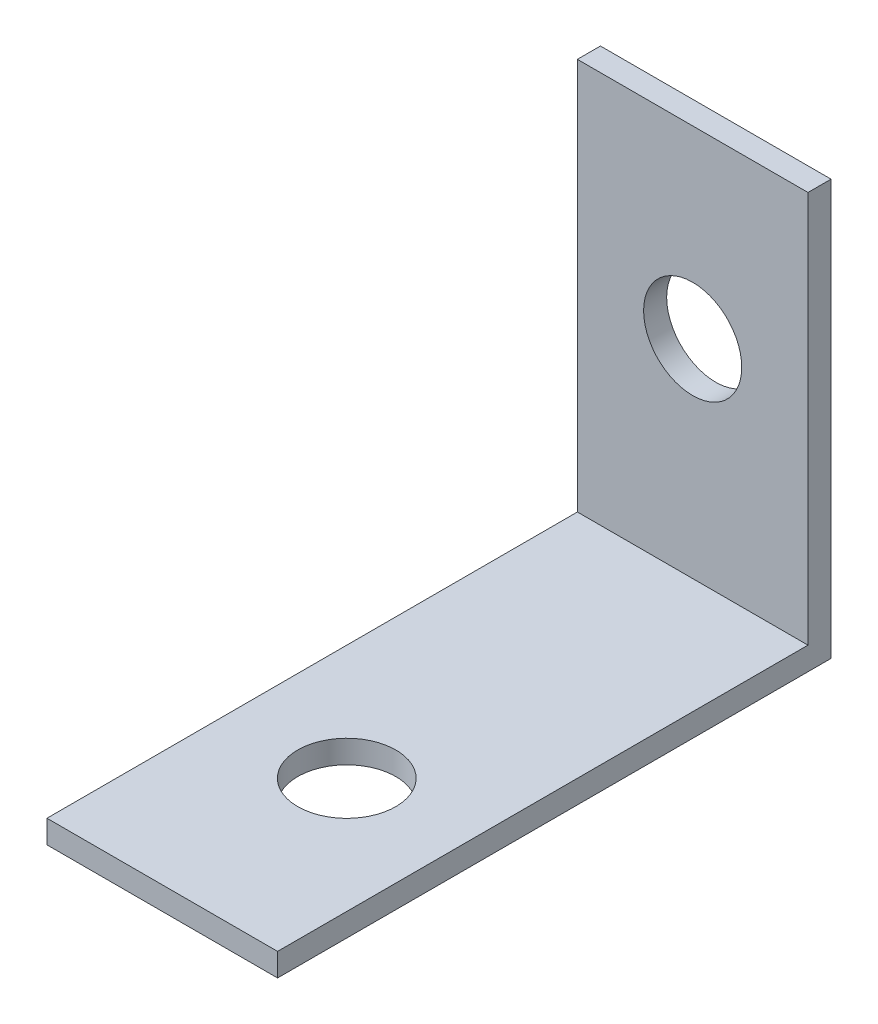
ISO-10303-21;
HEADER;
FILE_DESCRIPTION(('STEP AP214'),'2;1');
FILE_NAME('part.step','',(''),(''),'','','');
FILE_SCHEMA(('AUTOMOTIVE_DESIGN { 1 0 10303 214 1 1 1 1 }'));
ENDSEC;
DATA;
#1=APPLICATION_CONTEXT('core data for automotive mechanical design processes');
#2=APPLICATION_PROTOCOL_DEFINITION('international standard','automotive_design',2000,#1);
#3=PRODUCT_CONTEXT('',#1,'mechanical');
#4=PRODUCT('Part','Part','',(#3));
#5=PRODUCT_RELATED_PRODUCT_CATEGORY('part','',(#4));
#6=PRODUCT_DEFINITION_FORMATION('','',#4);
#7=PRODUCT_DEFINITION_CONTEXT('part definition',#1,'design');
#8=PRODUCT_DEFINITION('design','',#6,#7);
#9=PRODUCT_DEFINITION_SHAPE('','',#8);
#10=(LENGTH_UNIT() NAMED_UNIT(*) SI_UNIT(.MILLI.,.METRE.));
#11=(NAMED_UNIT(*) PLANE_ANGLE_UNIT() SI_UNIT($,.RADIAN.));
#12=(NAMED_UNIT(*) SI_UNIT($,.STERADIAN.) SOLID_ANGLE_UNIT());
#13=UNCERTAINTY_MEASURE_WITH_UNIT(LENGTH_MEASURE(1.E-05),#10,'distance_accuracy_value','');
#14=(GEOMETRIC_REPRESENTATION_CONTEXT(3) GLOBAL_UNCERTAINTY_ASSIGNED_CONTEXT((#13)) GLOBAL_UNIT_ASSIGNED_CONTEXT((#10,
#11,#12)) REPRESENTATION_CONTEXT('',''));
#15=CARTESIAN_POINT('',(0.,0.,0.));
#16=DIRECTION('',(0.,0.,1.));
#17=DIRECTION('',(1.,0.,0.));
#18=AXIS2_PLACEMENT_3D('',#15,#16,#17);
#19=CARTESIAN_POINT('',(15.875,0.,-1.5875));
#20=DIRECTION('',(0.,0.,1.));
#21=DIRECTION('',(1.,0.,0.));
#22=AXIS2_PLACEMENT_3D('',#19,#20,#21);
#23=PLANE('',#22);
#24=DIRECTION('',(0.,1.,0.));
#25=VECTOR('',#24,1.);
#26=CARTESIAN_POINT('',(15.875,0.,-1.5875));
#27=LINE('',#26,#25);
#28=CARTESIAN_POINT('',(15.875,-1.5875,-1.5875));
#29=VERTEX_POINT('',#28);
#30=CARTESIAN_POINT('',(15.875,26.9875,-1.5875));
#31=VERTEX_POINT('',#30);
#32=EDGE_CURVE('E85',#29,#31,#27,.T.);
#33=ORIENTED_EDGE('',*,*,#32,.F.);
#34=DIRECTION('',(1.,0.,0.));
#35=VECTOR('',#34,1.);
#36=CARTESIAN_POINT('',(0.,-1.5875,-1.5875));
#37=LINE('',#36,#35);
#38=CARTESIAN_POINT('',(0.,-1.5875,-1.5875));
#39=VERTEX_POINT('',#38);
#40=EDGE_CURVE('E125',#39,#29,#37,.T.);
#41=ORIENTED_EDGE('',*,*,#40,.F.);
#42=DIRECTION('',(0.,1.,0.));
#43=VECTOR('',#42,1.);
#44=CARTESIAN_POINT('',(0.,0.,-1.5875));
#45=LINE('',#44,#43);
#46=CARTESIAN_POINT('',(0.,26.9875,-1.5875));
#47=VERTEX_POINT('',#46);
#48=EDGE_CURVE('E141',#39,#47,#45,.T.);
#49=ORIENTED_EDGE('',*,*,#48,.T.);
#50=DIRECTION('',(-1.,0.,0.));
#51=VECTOR('',#50,1.);
#52=CARTESIAN_POINT('',(15.875,26.9875,-1.5875));
#53=LINE('',#52,#51);
#54=EDGE_CURVE('E11',#31,#47,#53,.T.);
#55=ORIENTED_EDGE('',*,*,#54,.F.);
#56=EDGE_LOOP('',(#33,#41,#49,#55));
#57=FACE_BOUND('',#56,.T.);
#58=CARTESIAN_POINT('',(7.9375,14.2875,-1.5875));
#59=DIRECTION('',(0.,0.,-1.));
#60=DIRECTION('',(-1.,0.,0.));
#61=AXIS2_PLACEMENT_3D('',#58,#59,#60);
#62=CIRCLE('',#61,3.37819999999999);
#63=CARTESIAN_POINT('',(4.55930000000001,14.2875,-1.5875));
#64=VERTEX_POINT('',#63);
#65=EDGE_CURVE('E135',#64,#64,#62,.T.);
#66=ORIENTED_EDGE('',*,*,#65,.F.);
#67=EDGE_LOOP('',(#66));
#68=FACE_BOUND('',#67,.T.);
#69=ADVANCED_FACE('F43',(#57,#68),#23,.F.);
#70=CARTESIAN_POINT('',(15.875,26.9875,0.));
#71=DIRECTION('',(0.,1.,0.));
#72=DIRECTION('',(0.,0.,1.));
#73=AXIS2_PLACEMENT_3D('',#70,#71,#72);
#74=PLANE('',#73);
#75=ORIENTED_EDGE('',*,*,#54,.T.);
#76=DIRECTION('',(0.,0.,-1.));
#77=VECTOR('',#76,1.);
#78=CARTESIAN_POINT('',(0.,26.9875,0.));
#79=LINE('',#78,#77);
#80=CARTESIAN_POINT('',(0.,26.9875,0.));
#81=VERTEX_POINT('',#80);
#82=EDGE_CURVE('E118',#81,#47,#79,.T.);
#83=ORIENTED_EDGE('',*,*,#82,.F.);
#84=DIRECTION('',(-1.,0.,0.));
#85=VECTOR('',#84,1.);
#86=CARTESIAN_POINT('',(15.875,26.9875,0.));
#87=LINE('',#86,#85);
#88=CARTESIAN_POINT('',(15.875,26.9875,0.));
#89=VERTEX_POINT('',#88);
#90=EDGE_CURVE('E51',#89,#81,#87,.T.);
#91=ORIENTED_EDGE('',*,*,#90,.F.);
#92=DIRECTION('',(0.,0.,-1.));
#93=VECTOR('',#92,1.);
#94=CARTESIAN_POINT('',(15.875,26.9875,0.));
#95=LINE('',#94,#93);
#96=EDGE_CURVE('E143',#89,#31,#95,.T.);
#97=ORIENTED_EDGE('',*,*,#96,.T.);
#98=EDGE_LOOP('',(#75,#83,#91,#97));
#99=FACE_BOUND('',#98,.T.);
#100=ADVANCED_FACE('F177',(#99),#74,.T.);
#101=CARTESIAN_POINT('',(15.875,0.,0.));
#102=DIRECTION('',(0.,0.,1.));
#103=DIRECTION('',(1.,0.,0.));
#104=AXIS2_PLACEMENT_3D('',#101,#102,#103);
#105=PLANE('',#104);
#106=ORIENTED_EDGE('',*,*,#90,.T.);
#107=DIRECTION('',(0.,1.,0.));
#108=VECTOR('',#107,1.);
#109=CARTESIAN_POINT('',(0.,0.,0.));
#110=LINE('',#109,#108);
#111=CARTESIAN_POINT('',(0.,0.,0.));
#112=VERTEX_POINT('',#111);
#113=EDGE_CURVE('E106',#112,#81,#110,.T.);
#114=ORIENTED_EDGE('',*,*,#113,.F.);
#115=DIRECTION('',(1.,0.,0.));
#116=VECTOR('',#115,1.);
#117=CARTESIAN_POINT('',(0.,0.,0.));
#118=LINE('',#117,#116);
#119=CARTESIAN_POINT('',(15.875,0.,0.));
#120=VERTEX_POINT('',#119);
#121=EDGE_CURVE('E115',#112,#120,#118,.T.);
#122=ORIENTED_EDGE('',*,*,#121,.T.);
#123=DIRECTION('',(0.,1.,0.));
#124=VECTOR('',#123,1.);
#125=CARTESIAN_POINT('',(15.875,0.,0.));
#126=LINE('',#125,#124);
#127=EDGE_CURVE('E147',#120,#89,#126,.T.);
#128=ORIENTED_EDGE('',*,*,#127,.T.);
#129=EDGE_LOOP('',(#106,#114,#122,#128));
#130=FACE_BOUND('',#129,.T.);
#131=CARTESIAN_POINT('',(7.9375,14.2875,0.));
#132=DIRECTION('',(0.,0.,1.));
#133=DIRECTION('',(1.,0.,0.));
#134=AXIS2_PLACEMENT_3D('',#131,#132,#133);
#135=CIRCLE('',#134,3.37819999999999);
#136=CARTESIAN_POINT('',(11.3157,14.2875,0.));
#137=VERTEX_POINT('',#136);
#138=EDGE_CURVE('E138',#137,#137,#135,.T.);
#139=ORIENTED_EDGE('',*,*,#138,.F.);
#140=EDGE_LOOP('',(#139));
#141=FACE_BOUND('',#140,.T.);
#142=ADVANCED_FACE('F112',(#130,#141),#105,.T.);
#143=CARTESIAN_POINT('',(15.875,0.,36.5125));
#144=DIRECTION('',(0.,1.,0.));
#145=DIRECTION('',(0.,0.,1.));
#146=AXIS2_PLACEMENT_3D('',#143,#144,#145);
#147=PLANE('',#146);
#148=DIRECTION('',(0.,0.,-1.));
#149=VECTOR('',#148,1.);
#150=CARTESIAN_POINT('',(15.875,0.,36.5125));
#151=LINE('',#150,#149);
#152=CARTESIAN_POINT('',(15.875,0.,36.5125));
#153=VERTEX_POINT('',#152);
#154=EDGE_CURVE('E124',#153,#120,#151,.T.);
#155=ORIENTED_EDGE('',*,*,#154,.T.);
#156=ORIENTED_EDGE('',*,*,#121,.F.);
#157=DIRECTION('',(0.,0.,-1.));
#158=VECTOR('',#157,1.);
#159=CARTESIAN_POINT('',(0.,0.,36.5125));
#160=LINE('',#159,#158);
#161=CARTESIAN_POINT('',(0.,0.,36.5125));
#162=VERTEX_POINT('',#161);
#163=EDGE_CURVE('E101',#162,#112,#160,.T.);
#164=ORIENTED_EDGE('',*,*,#163,.F.);
#165=DIRECTION('',(-1.,0.,0.));
#166=VECTOR('',#165,1.);
#167=CARTESIAN_POINT('',(15.875,0.,36.5125));
#168=LINE('',#167,#166);
#169=EDGE_CURVE('E73',#153,#162,#168,.T.);
#170=ORIENTED_EDGE('',*,*,#169,.F.);
#171=EDGE_LOOP('',(#155,#156,#164,#170));
#172=FACE_BOUND('',#171,.T.);
#173=CARTESIAN_POINT('',(7.9375,0.,23.8125));
#174=DIRECTION('',(0.,1.,0.));
#175=DIRECTION('',(0.,0.,1.));
#176=AXIS2_PLACEMENT_3D('',#173,#174,#175);
#177=CIRCLE('',#176,3.37819999999999);
#178=CARTESIAN_POINT('',(7.9375,0.,27.1907));
#179=VERTEX_POINT('',#178);
#180=EDGE_CURVE('E127',#179,#179,#177,.T.);
#181=ORIENTED_EDGE('',*,*,#180,.F.);
#182=EDGE_LOOP('',(#181));
#183=FACE_BOUND('',#182,.T.);
#184=ADVANCED_FACE('F121',(#172,#183),#147,.T.);
#185=CARTESIAN_POINT('',(15.875,-1.5875,36.5125));
#186=DIRECTION('',(0.,0.,1.));
#187=DIRECTION('',(1.,0.,0.));
#188=AXIS2_PLACEMENT_3D('',#185,#186,#187);
#189=PLANE('',#188);
#190=ORIENTED_EDGE('',*,*,#169,.T.);
#191=DIRECTION('',(0.,1.,0.));
#192=VECTOR('',#191,1.);
#193=CARTESIAN_POINT('',(0.,-1.5875,36.5125));
#194=LINE('',#193,#192);
#195=CARTESIAN_POINT('',(0.,-1.5875,36.5125));
#196=VERTEX_POINT('',#195);
#197=EDGE_CURVE('E107',#196,#162,#194,.T.);
#198=ORIENTED_EDGE('',*,*,#197,.F.);
#199=DIRECTION('',(-1.,0.,0.));
#200=VECTOR('',#199,1.);
#201=CARTESIAN_POINT('',(15.875,-1.5875,36.5125));
#202=LINE('',#201,#200);
#203=CARTESIAN_POINT('',(15.875,-1.5875,36.5125));
#204=VERTEX_POINT('',#203);
#205=EDGE_CURVE('E59',#204,#196,#202,.T.);
#206=ORIENTED_EDGE('',*,*,#205,.F.);
#207=DIRECTION('',(0.,1.,0.));
#208=VECTOR('',#207,1.);
#209=CARTESIAN_POINT('',(15.875,-1.5875,36.5125));
#210=LINE('',#209,#208);
#211=EDGE_CURVE('E150',#204,#153,#210,.T.);
#212=ORIENTED_EDGE('',*,*,#211,.T.);
#213=EDGE_LOOP('',(#190,#198,#206,#212));
#214=FACE_BOUND('',#213,.T.);
#215=ADVANCED_FACE('F167',(#214),#189,.T.);
#216=CARTESIAN_POINT('',(15.875,-1.5875,36.5125));
#217=DIRECTION('',(0.,1.,0.));
#218=DIRECTION('',(0.,0.,1.));
#219=AXIS2_PLACEMENT_3D('',#216,#217,#218);
#220=PLANE('',#219);
#221=ORIENTED_EDGE('',*,*,#205,.T.);
#222=DIRECTION('',(0.,0.,-1.));
#223=VECTOR('',#222,1.);
#224=CARTESIAN_POINT('',(0.,-1.5875,36.5125));
#225=LINE('',#224,#223);
#226=EDGE_CURVE('E144',#196,#39,#225,.T.);
#227=ORIENTED_EDGE('',*,*,#226,.T.);
#228=ORIENTED_EDGE('',*,*,#40,.T.);
#229=DIRECTION('',(0.,0.,-1.));
#230=VECTOR('',#229,1.);
#231=CARTESIAN_POINT('',(15.875,-1.5875,36.5125));
#232=LINE('',#231,#230);
#233=EDGE_CURVE('E152',#204,#29,#232,.T.);
#234=ORIENTED_EDGE('',*,*,#233,.F.);
#235=EDGE_LOOP('',(#221,#227,#228,#234));
#236=FACE_BOUND('',#235,.T.);
#237=CARTESIAN_POINT('',(7.9375,-1.5875,23.8125));
#238=DIRECTION('',(0.,1.,0.));
#239=DIRECTION('',(0.,0.,1.));
#240=AXIS2_PLACEMENT_3D('',#237,#238,#239);
#241=CIRCLE('',#240,3.3782);
#242=CARTESIAN_POINT('',(7.9375,-1.5875,27.1907));
#243=VERTEX_POINT('',#242);
#244=EDGE_CURVE('E132',#243,#243,#241,.T.);
#245=ORIENTED_EDGE('',*,*,#244,.T.);
#246=EDGE_LOOP('',(#245));
#247=FACE_BOUND('',#246,.T.);
#248=ADVANCED_FACE('F160',(#236,#247),#220,.F.);
#249=CARTESIAN_POINT('',(15.875,0.79375,0.793750000000001));
#250=DIRECTION('',(-1.,0.,0.));
#251=DIRECTION('',(0.,0.,1.));
#252=AXIS2_PLACEMENT_3D('',#249,#250,#251);
#253=PLANE('',#252);
#254=ORIENTED_EDGE('',*,*,#233,.T.);
#255=ORIENTED_EDGE('',*,*,#32,.T.);
#256=ORIENTED_EDGE('',*,*,#96,.F.);
#257=ORIENTED_EDGE('',*,*,#127,.F.);
#258=ORIENTED_EDGE('',*,*,#154,.F.);
#259=ORIENTED_EDGE('',*,*,#211,.F.);
#260=EDGE_LOOP('',(#254,#255,#256,#257,#258,#259));
#261=FACE_BOUND('',#260,.T.);
#262=ADVANCED_FACE('F166',(#261),#253,.F.);
#263=CARTESIAN_POINT('',(0.,0.79375,0.793750000000001));
#264=DIRECTION('',(-1.,0.,0.));
#265=DIRECTION('',(0.,0.,1.));
#266=AXIS2_PLACEMENT_3D('',#263,#264,#265);
#267=PLANE('',#266);
#268=ORIENTED_EDGE('',*,*,#48,.F.);
#269=ORIENTED_EDGE('',*,*,#226,.F.);
#270=ORIENTED_EDGE('',*,*,#197,.T.);
#271=ORIENTED_EDGE('',*,*,#163,.T.);
#272=ORIENTED_EDGE('',*,*,#113,.T.);
#273=ORIENTED_EDGE('',*,*,#82,.T.);
#274=EDGE_LOOP('',(#268,#269,#270,#271,#272,#273));
#275=FACE_BOUND('',#274,.T.);
#276=ADVANCED_FACE('F104',(#275),#267,.T.);
#277=CARTESIAN_POINT('',(7.9375,14.2875,-1.5875));
#278=DIRECTION('',(0.,0.,-1.));
#279=DIRECTION('',(-1.,0.,0.));
#280=AXIS2_PLACEMENT_3D('',#277,#278,#279);
#281=CYLINDRICAL_SURFACE('',#280,3.37819999999999);
#282=ORIENTED_EDGE('',*,*,#138,.T.);
#283=EDGE_LOOP('',(#282));
#284=FACE_BOUND('',#283,.T.);
#285=ORIENTED_EDGE('',*,*,#65,.T.);
#286=EDGE_LOOP('',(#285));
#287=FACE_BOUND('',#286,.T.);
#288=ADVANCED_FACE('F216',(#284,#287),#281,.F.);
#289=CARTESIAN_POINT('',(7.9375,0.,23.8125));
#290=DIRECTION('',(0.,1.,0.));
#291=DIRECTION('',(0.,0.,1.));
#292=AXIS2_PLACEMENT_3D('',#289,#290,#291);
#293=CYLINDRICAL_SURFACE('',#292,3.37819999999999);
#294=ORIENTED_EDGE('',*,*,#244,.F.);
#295=EDGE_LOOP('',(#294));
#296=FACE_BOUND('',#295,.T.);
#297=ORIENTED_EDGE('',*,*,#180,.T.);
#298=EDGE_LOOP('',(#297));
#299=FACE_BOUND('',#298,.T.);
#300=ADVANCED_FACE('F228',(#296,#299),#293,.F.);
#301=CLOSED_SHELL('',(#69,#100,#142,#184,#215,#248,#262,#276,#288,#300));
#302=MANIFOLD_SOLID_BREP('B2',#301);
#303=ADVANCED_BREP_SHAPE_REPRESENTATION('',(#18,#302),#14);
#304=SHAPE_DEFINITION_REPRESENTATION(#9,#303);
ENDSEC;
END-ISO-10303-21;
